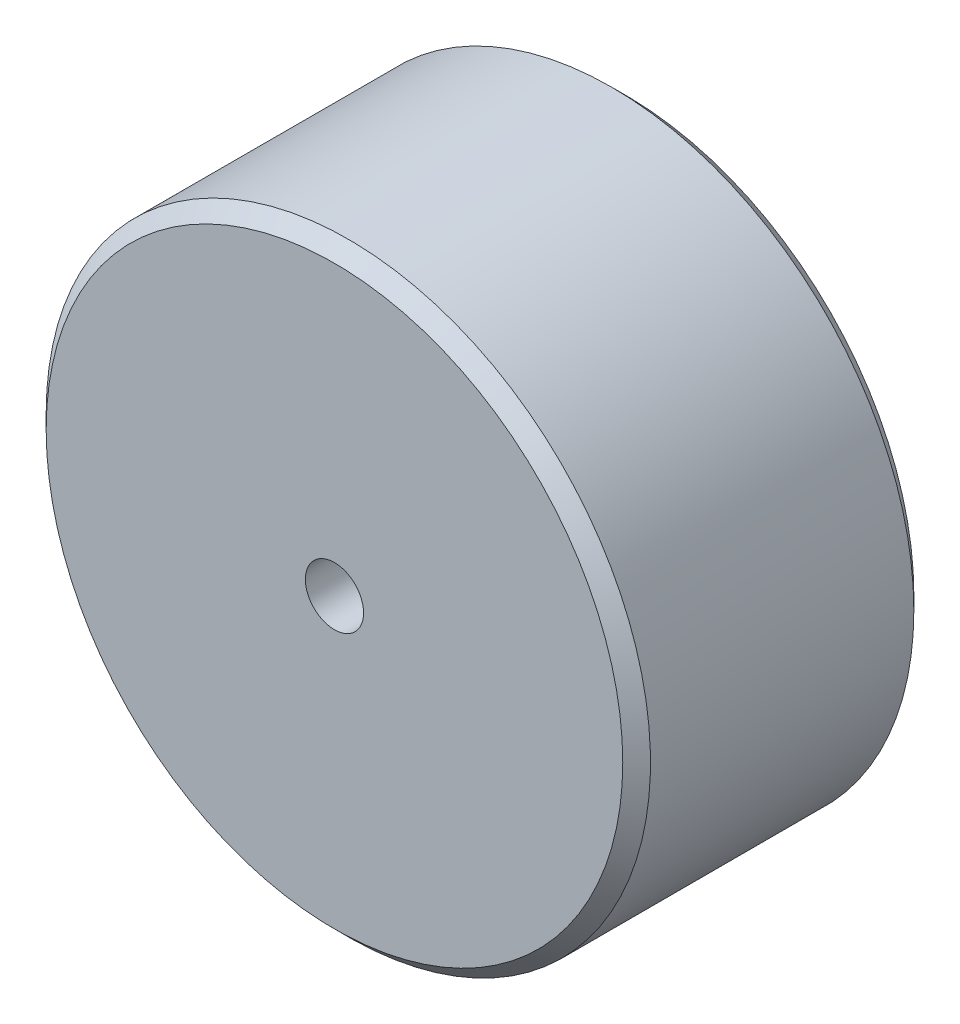
ISO-10303-21;
HEADER;
FILE_DESCRIPTION(('STEP AP214'),'2;1');
FILE_NAME('part.step','',(''),(''),'','','');
FILE_SCHEMA(('AUTOMOTIVE_DESIGN { 1 0 10303 214 1 1 1 1 }'));
ENDSEC;
DATA;
#1=APPLICATION_CONTEXT('core data for automotive mechanical design processes');
#2=APPLICATION_PROTOCOL_DEFINITION('international standard','automotive_design',2000,#1);
#3=PRODUCT_CONTEXT('',#1,'mechanical');
#4=PRODUCT('Part','Part','',(#3));
#5=PRODUCT_RELATED_PRODUCT_CATEGORY('part','',(#4));
#6=PRODUCT_DEFINITION_FORMATION('','',#4);
#7=PRODUCT_DEFINITION_CONTEXT('part definition',#1,'design');
#8=PRODUCT_DEFINITION('design','',#6,#7);
#9=PRODUCT_DEFINITION_SHAPE('','',#8);
#10=(LENGTH_UNIT() NAMED_UNIT(*) SI_UNIT(.MILLI.,.METRE.));
#11=(NAMED_UNIT(*) PLANE_ANGLE_UNIT() SI_UNIT($,.RADIAN.));
#12=(NAMED_UNIT(*) SI_UNIT($,.STERADIAN.) SOLID_ANGLE_UNIT());
#13=UNCERTAINTY_MEASURE_WITH_UNIT(LENGTH_MEASURE(1.E-05),#10,'distance_accuracy_value','');
#14=(GEOMETRIC_REPRESENTATION_CONTEXT(3) GLOBAL_UNCERTAINTY_ASSIGNED_CONTEXT((#13)) GLOBAL_UNIT_ASSIGNED_CONTEXT((#10,
#11,#12)) REPRESENTATION_CONTEXT('',''));
#15=CARTESIAN_POINT('',(0.,0.,0.));
#16=DIRECTION('',(0.,0.,1.));
#17=DIRECTION('',(1.,0.,0.));
#18=AXIS2_PLACEMENT_3D('',#15,#16,#17);
#19=CARTESIAN_POINT('',(0.,0.,21.));
#20=DIRECTION('',(0.,0.,-1.));
#21=DIRECTION('',(-1.,0.,0.));
#22=AXIS2_PLACEMENT_3D('',#19,#20,#21);
#23=CYLINDRICAL_SURFACE('',#22,21.8);
#24=CARTESIAN_POINT('',(0.,0.,1.00000000000004));
#25=DIRECTION('',(0.,0.,1.));
#26=DIRECTION('',(1.,0.,0.));
#27=AXIS2_PLACEMENT_3D('',#24,#25,#26);
#28=CIRCLE('',#27,21.8);
#29=CARTESIAN_POINT('',(-21.8,0.,1.00000000000004));
#30=VERTEX_POINT('',#29);
#31=EDGE_CURVE('E44',#30,#30,#28,.T.);
#32=CARTESIAN_POINT('',(0.,0.,20.));
#33=DIRECTION('',(0.,0.,1.));
#34=DIRECTION('',(1.,0.,0.));
#35=AXIS2_PLACEMENT_3D('',#32,#33,#34);
#36=CIRCLE('',#35,21.8);
#37=CARTESIAN_POINT('',(-21.8,0.,20.));
#38=VERTEX_POINT('',#37);
#39=EDGE_CURVE('E48',#38,#38,#36,.F.);
#40=CARTESIAN_POINT('',(-21.8,0.,1.00000000000004));
#41=CARTESIAN_POINT('',(-21.8,0.,1.19791666666671));
#42=CARTESIAN_POINT('',(-21.8,0.,1.39583333333338));
#43=CARTESIAN_POINT('',(-21.8,0.,1.79166666666671));
#44=CARTESIAN_POINT('',(-21.8,0.,1.98958333333338));
#45=CARTESIAN_POINT('',(-21.8,0.,2.38541666666671));
#46=CARTESIAN_POINT('',(-21.8,0.,2.58333333333337));
#47=CARTESIAN_POINT('',(-21.8,0.,2.97916666666671));
#48=CARTESIAN_POINT('',(-21.8,0.,3.17708333333337));
#49=CARTESIAN_POINT('',(-21.8,0.,3.57291666666671));
#50=CARTESIAN_POINT('',(-21.8,0.,3.77083333333337));
#51=CARTESIAN_POINT('',(-21.8,0.,4.16666666666671));
#52=CARTESIAN_POINT('',(-21.8,0.,4.36458333333338));
#53=CARTESIAN_POINT('',(-21.8,0.,4.76041666666671));
#54=CARTESIAN_POINT('',(-21.8,0.,4.95833333333338));
#55=CARTESIAN_POINT('',(-21.8,0.,5.35416666666671));
#56=CARTESIAN_POINT('',(-21.8,0.,5.55208333333337));
#57=CARTESIAN_POINT('',(-21.8,0.,5.94791666666671));
#58=CARTESIAN_POINT('',(-21.8,0.,6.14583333333337));
#59=CARTESIAN_POINT('',(-21.8,0.,6.54166666666671));
#60=CARTESIAN_POINT('',(-21.8,0.,6.73958333333337));
#61=CARTESIAN_POINT('',(-21.8,0.,7.13541666666671));
#62=CARTESIAN_POINT('',(-21.8,0.,7.33333333333337));
#63=CARTESIAN_POINT('',(-21.8,0.,7.72916666666671));
#64=CARTESIAN_POINT('',(-21.8,0.,7.92708333333337));
#65=CARTESIAN_POINT('',(-21.8,0.,8.32291666666671));
#66=CARTESIAN_POINT('',(-21.8,0.,8.52083333333337));
#67=CARTESIAN_POINT('',(-21.8,0.,8.91666666666671));
#68=CARTESIAN_POINT('',(-21.8,0.,9.11458333333337));
#69=CARTESIAN_POINT('',(-21.8,0.,9.51041666666671));
#70=CARTESIAN_POINT('',(-21.8,0.,9.70833333333337));
#71=CARTESIAN_POINT('',(-21.8,0.,10.1041666666667));
#72=CARTESIAN_POINT('',(-21.8,0.,10.3020833333334));
#73=CARTESIAN_POINT('',(-21.8,0.,10.6979166666667));
#74=CARTESIAN_POINT('',(-21.8,0.,10.8958333333334));
#75=CARTESIAN_POINT('',(-21.8,0.,11.2916666666667));
#76=CARTESIAN_POINT('',(-21.8,0.,11.4895833333334));
#77=CARTESIAN_POINT('',(-21.8,0.,11.8854166666667));
#78=CARTESIAN_POINT('',(-21.8,0.,12.0833333333334));
#79=CARTESIAN_POINT('',(-21.8,0.,12.4791666666667));
#80=CARTESIAN_POINT('',(-21.8,0.,12.6770833333334));
#81=CARTESIAN_POINT('',(-21.8,0.,13.0729166666667));
#82=CARTESIAN_POINT('',(-21.8,0.,13.2708333333334));
#83=CARTESIAN_POINT('',(-21.8,0.,13.6666666666667));
#84=CARTESIAN_POINT('',(-21.8,0.,13.8645833333334));
#85=CARTESIAN_POINT('',(-21.8,0.,14.2604166666667));
#86=CARTESIAN_POINT('',(-21.8,0.,14.4583333333334));
#87=CARTESIAN_POINT('',(-21.8,0.,14.8541666666667));
#88=CARTESIAN_POINT('',(-21.8,0.,15.0520833333334));
#89=CARTESIAN_POINT('',(-21.8,0.,15.4479166666667));
#90=CARTESIAN_POINT('',(-21.8,0.,15.6458333333334));
#91=CARTESIAN_POINT('',(-21.8,0.,16.0416666666667));
#92=CARTESIAN_POINT('',(-21.8,0.,16.2395833333334));
#93=CARTESIAN_POINT('',(-21.8,0.,16.6354166666667));
#94=CARTESIAN_POINT('',(-21.8,0.,16.8333333333334));
#95=CARTESIAN_POINT('',(-21.8,0.,17.2291666666667));
#96=CARTESIAN_POINT('',(-21.8,0.,17.4270833333334));
#97=CARTESIAN_POINT('',(-21.8,0.,17.8229166666667));
#98=CARTESIAN_POINT('',(-21.8,0.,18.0208333333334));
#99=CARTESIAN_POINT('',(-21.8,0.,18.4166666666667));
#100=CARTESIAN_POINT('',(-21.8,0.,18.6145833333334));
#101=CARTESIAN_POINT('',(-21.8,0.,19.0104166666667));
#102=CARTESIAN_POINT('',(-21.8,0.,19.2083333333334));
#103=CARTESIAN_POINT('',(-21.8,0.,19.6041666666667));
#104=CARTESIAN_POINT('',(-21.8,0.,19.8020833333334));
#105=CARTESIAN_POINT('',(-21.8,0.,20.));
#106=B_SPLINE_CURVE_WITH_KNOTS('',3,(#40,#41,#42,#43,#44,#45,#46,#47,#48,#49,#50,#51,#52,#53,
#54,#55,#56,#57,#58,#59,#60,#61,#62,#63,#64,#65,#66,#67,#68,#69,#70,#71,#72,#73,#74,#75,#76,#77,
#78,#79,#80,#81,#82,#83,#84,#85,#86,#87,#88,#89,#90,#91,#92,#93,#94,#95,#96,#97,#98,#99,#100,
#101,#102,#103,#104,#105),.UNSPECIFIED.,.F.,.F.,(4,2,2,2,2,2,2,2,2,2,2,2,2,2,2,2,2,2,2,2,2,2,2,
2,2,2,2,2,2,2,2,2,4),(0.,0.593750000000001,1.1875,1.78125,2.375,2.96875,3.5625,4.15625,4.75,
5.34375,5.9375,6.53125,7.125,7.71875,8.3125,8.90625,9.5,10.09375,10.6875,11.28125,11.875,
12.46875,13.0625,13.65625,14.25,14.84375,15.4375,16.03125,16.625,17.21875,17.8125,18.40625,19.),.UNSPECIFIED.);
#107=EDGE_CURVE('BSEAM33',#30,#38,#106,.T.);
#108=ORIENTED_EDGE('',*,*,#31,.T.);
#109=ORIENTED_EDGE('',*,*,#39,.T.);
#110=ORIENTED_EDGE('',*,*,#107,.T.);
#111=ORIENTED_EDGE('',*,*,#107,.F.);
#112=EDGE_LOOP('',(#108,#110,#109,#111));
#113=FACE_BOUND('',#112,.T.);
#114=ADVANCED_FACE('F33',(#113),#23,.T.);
#115=CARTESIAN_POINT('',(0.,0.,21.));
#116=DIRECTION('',(0.,0.,1.));
#117=DIRECTION('',(1.,0.,0.));
#118=AXIS2_PLACEMENT_3D('',#115,#116,#117);
#119=PLANE('',#118);
#120=CARTESIAN_POINT('',(0.,0.,21.));
#121=DIRECTION('',(0.,0.,1.));
#122=DIRECTION('',(1.,0.,0.));
#123=AXIS2_PLACEMENT_3D('',#120,#121,#122);
#124=CIRCLE('',#123,2.1);
#125=CARTESIAN_POINT('',(2.1,0.,21.));
#126=VERTEX_POINT('',#125);
#127=EDGE_CURVE('E54',#126,#126,#124,.T.);
#128=ORIENTED_EDGE('',*,*,#127,.F.);
#129=EDGE_LOOP('',(#128));
#130=FACE_BOUND('',#129,.T.);
#131=CARTESIAN_POINT('',(0.,0.,21.));
#132=DIRECTION('',(0.,0.,1.));
#133=DIRECTION('',(1.,0.,0.));
#134=AXIS2_PLACEMENT_3D('',#131,#132,#133);
#135=CIRCLE('',#134,20.8);
#136=CARTESIAN_POINT('',(20.8,0.,21.));
#137=VERTEX_POINT('',#136);
#138=EDGE_CURVE('E10',#137,#137,#135,.T.);
#139=ORIENTED_EDGE('',*,*,#138,.T.);
#140=EDGE_LOOP('',(#139));
#141=FACE_BOUND('',#140,.T.);
#142=ADVANCED_FACE('F68',(#130,#141),#119,.T.);
#143=CARTESIAN_POINT('',(0.,0.,0.));
#144=DIRECTION('',(0.,0.,1.));
#145=DIRECTION('',(1.,0.,0.));
#146=AXIS2_PLACEMENT_3D('',#143,#144,#145);
#147=PLANE('',#146);
#148=CARTESIAN_POINT('',(0.,0.,0.));
#149=DIRECTION('',(0.,0.,1.));
#150=DIRECTION('',(1.,0.,0.));
#151=AXIS2_PLACEMENT_3D('',#148,#149,#150);
#152=CIRCLE('',#151,20.8);
#153=CARTESIAN_POINT('',(20.8,0.,0.));
#154=VERTEX_POINT('',#153);
#155=EDGE_CURVE('E40',#154,#154,#152,.F.);
#156=ORIENTED_EDGE('',*,*,#155,.T.);
#157=EDGE_LOOP('',(#156));
#158=FACE_BOUND('',#157,.T.);
#159=ADVANCED_FACE('F70',(#158),#147,.F.);
#160=CARTESIAN_POINT('',(0.,0.,1.00000000000004));
#161=DIRECTION('',(0.,0.,1.));
#162=DIRECTION('',(1.,0.,0.));
#163=AXIS2_PLACEMENT_3D('',#160,#161,#162);
#164=CONICAL_SURFACE('',#163,21.8,0.78539816339745);
#165=ORIENTED_EDGE('',*,*,#155,.F.);
#166=EDGE_LOOP('',(#165));
#167=FACE_BOUND('',#166,.T.);
#168=ORIENTED_EDGE('',*,*,#31,.F.);
#169=EDGE_LOOP('',(#168));
#170=FACE_BOUND('',#169,.T.);
#171=ADVANCED_FACE('F76',(#167,#170),#164,.T.);
#172=CARTESIAN_POINT('',(0.,0.,21.));
#173=DIRECTION('',(0.,0.,-1.));
#174=DIRECTION('',(-1.,0.,0.));
#175=AXIS2_PLACEMENT_3D('',#172,#173,#174);
#176=CONICAL_SURFACE('',#175,20.8,0.785398163397443);
#177=ORIENTED_EDGE('',*,*,#39,.F.);
#178=EDGE_LOOP('',(#177));
#179=FACE_BOUND('',#178,.T.);
#180=ORIENTED_EDGE('',*,*,#138,.F.);
#181=EDGE_LOOP('',(#180));
#182=FACE_BOUND('',#181,.T.);
#183=ADVANCED_FACE('F35',(#179,#182),#176,.T.);
#184=CARTESIAN_POINT('',(0.,0.,15.2));
#185=DIRECTION('',(0.,0.,1.));
#186=DIRECTION('',(1.,0.,0.));
#187=AXIS2_PLACEMENT_3D('',#184,#185,#186);
#188=CYLINDRICAL_SURFACE('',#187,2.1);
#189=CARTESIAN_POINT('',(0.,0.,15.2));
#190=DIRECTION('',(0.,0.,1.));
#191=DIRECTION('',(1.,0.,0.));
#192=AXIS2_PLACEMENT_3D('',#189,#190,#191);
#193=CIRCLE('',#192,2.1);
#194=CARTESIAN_POINT('',(2.1,0.,15.2));
#195=VERTEX_POINT('',#194);
#196=EDGE_CURVE('E53',#195,#195,#193,.T.);
#197=ORIENTED_EDGE('',*,*,#196,.F.);
#198=EDGE_LOOP('',(#197));
#199=FACE_BOUND('',#198,.T.);
#200=ORIENTED_EDGE('',*,*,#127,.T.);
#201=EDGE_LOOP('',(#200));
#202=FACE_BOUND('',#201,.T.);
#203=ADVANCED_FACE('F62',(#199,#202),#188,.F.);
#204=CARTESIAN_POINT('',(0.,0.,15.2));
#205=DIRECTION('',(0.,0.,1.));
#206=DIRECTION('',(1.,0.,0.));
#207=AXIS2_PLACEMENT_3D('',#204,#205,#206);
#208=PLANE('',#207);
#209=ORIENTED_EDGE('',*,*,#196,.T.);
#210=EDGE_LOOP('',(#209));
#211=FACE_BOUND('',#210,.T.);
#212=ADVANCED_FACE('F60',(#211),#208,.T.);
#213=CLOSED_SHELL('',(#114,#142,#159,#171,#183,#203,#212));
#214=MANIFOLD_SOLID_BREP('B2',#213);
#215=ADVANCED_BREP_SHAPE_REPRESENTATION('',(#18,#214),#14);
#216=SHAPE_DEFINITION_REPRESENTATION(#9,#215);
ENDSEC;
END-ISO-10303-21;
